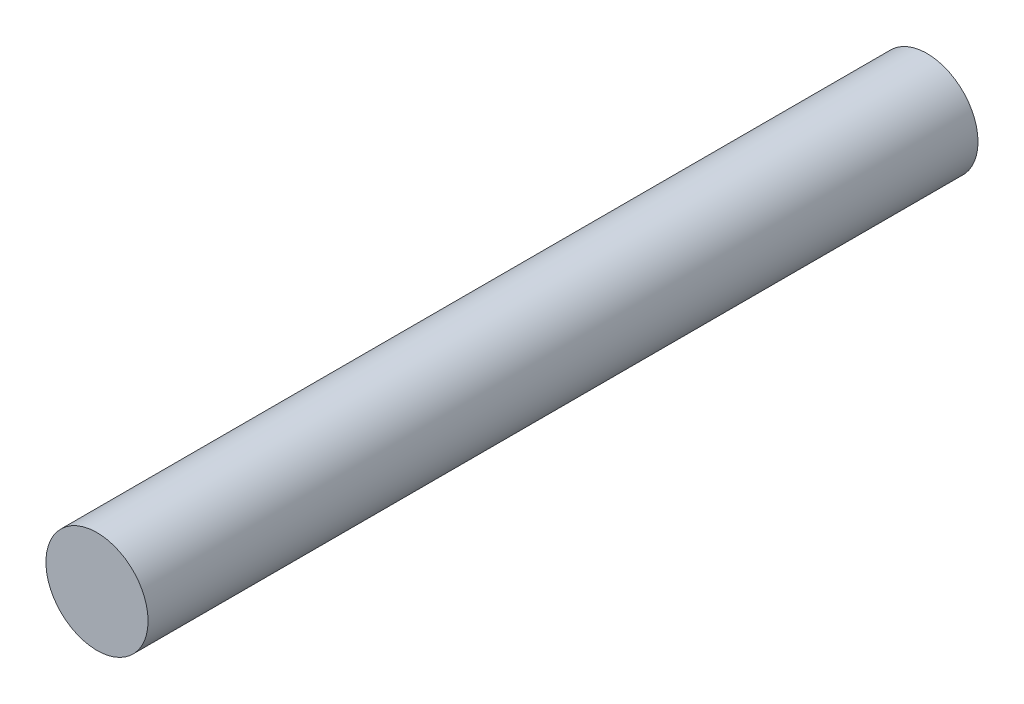
ISO-10303-21;
HEADER;
FILE_DESCRIPTION(('STEP AP214'),'2;1');
FILE_NAME('part.step','',(''),(''),'','','');
FILE_SCHEMA(('AUTOMOTIVE_DESIGN { 1 0 10303 214 1 1 1 1 }'));
ENDSEC;
DATA;
#1=APPLICATION_CONTEXT('core data for automotive mechanical design processes');
#2=APPLICATION_PROTOCOL_DEFINITION('international standard','automotive_design',2000,#1);
#3=PRODUCT_CONTEXT('',#1,'mechanical');
#4=PRODUCT('Part','Part','',(#3));
#5=PRODUCT_RELATED_PRODUCT_CATEGORY('part','',(#4));
#6=PRODUCT_DEFINITION_FORMATION('','',#4);
#7=PRODUCT_DEFINITION_CONTEXT('part definition',#1,'design');
#8=PRODUCT_DEFINITION('design','',#6,#7);
#9=PRODUCT_DEFINITION_SHAPE('','',#8);
#10=(LENGTH_UNIT() NAMED_UNIT(*) SI_UNIT(.MILLI.,.METRE.));
#11=(NAMED_UNIT(*) PLANE_ANGLE_UNIT() SI_UNIT($,.RADIAN.));
#12=(NAMED_UNIT(*) SI_UNIT($,.STERADIAN.) SOLID_ANGLE_UNIT());
#13=UNCERTAINTY_MEASURE_WITH_UNIT(LENGTH_MEASURE(1.E-05),#10,'distance_accuracy_value','');
#14=(GEOMETRIC_REPRESENTATION_CONTEXT(3) GLOBAL_UNCERTAINTY_ASSIGNED_CONTEXT((#13)) GLOBAL_UNIT_ASSIGNED_CONTEXT((#10,
#11,#12)) REPRESENTATION_CONTEXT('',''));
#15=CARTESIAN_POINT('',(0.,0.,0.));
#16=DIRECTION('',(0.,0.,1.));
#17=DIRECTION('',(1.,0.,0.));
#18=AXIS2_PLACEMENT_3D('',#15,#16,#17);
#19=CARTESIAN_POINT('',(0.,0.,65.));
#20=DIRECTION('',(0.,0.,-1.));
#21=DIRECTION('',(-1.,0.,0.));
#22=AXIS2_PLACEMENT_3D('',#19,#20,#21);
#23=CYLINDRICAL_SURFACE('',#22,4.);
#24=CARTESIAN_POINT('',(0.,0.,65.));
#25=DIRECTION('',(0.,0.,1.));
#26=DIRECTION('',(1.,0.,0.));
#27=AXIS2_PLACEMENT_3D('',#24,#25,#26);
#28=CIRCLE('',#27,4.);
#29=CARTESIAN_POINT('',(4.,0.,65.));
#30=VERTEX_POINT('',#29);
#31=EDGE_CURVE('E10',#30,#30,#28,.T.);
#32=ORIENTED_EDGE('',*,*,#31,.F.);
#33=EDGE_LOOP('',(#32));
#34=FACE_BOUND('',#33,.T.);
#35=CARTESIAN_POINT('',(0.,0.,0.));
#36=DIRECTION('',(0.,0.,1.));
#37=DIRECTION('',(1.,0.,0.));
#38=AXIS2_PLACEMENT_3D('',#35,#36,#37);
#39=CIRCLE('',#38,4.);
#40=CARTESIAN_POINT('',(4.,0.,0.));
#41=VERTEX_POINT('',#40);
#42=EDGE_CURVE('E40',#41,#41,#39,.T.);
#43=ORIENTED_EDGE('',*,*,#42,.T.);
#44=EDGE_LOOP('',(#43));
#45=FACE_BOUND('',#44,.T.);
#46=ADVANCED_FACE('F37',(#34,#45),#23,.T.);
#47=CARTESIAN_POINT('',(0.,0.,65.));
#48=DIRECTION('',(0.,0.,1.));
#49=DIRECTION('',(1.,0.,0.));
#50=AXIS2_PLACEMENT_3D('',#47,#48,#49);
#51=PLANE('',#50);
#52=ORIENTED_EDGE('',*,*,#31,.T.);
#53=EDGE_LOOP('',(#52));
#54=FACE_BOUND('',#53,.T.);
#55=ADVANCED_FACE('F54',(#54),#51,.T.);
#56=CARTESIAN_POINT('',(0.,0.,0.));
#57=DIRECTION('',(0.,0.,1.));
#58=DIRECTION('',(1.,0.,0.));
#59=AXIS2_PLACEMENT_3D('',#56,#57,#58);
#60=PLANE('',#59);
#61=ORIENTED_EDGE('',*,*,#42,.F.);
#62=EDGE_LOOP('',(#61));
#63=FACE_BOUND('',#62,.T.);
#64=ADVANCED_FACE('F52',(#63),#60,.F.);
#65=CLOSED_SHELL('',(#46,#55,#64));
#66=MANIFOLD_SOLID_BREP('B2',#65);
#67=ADVANCED_BREP_SHAPE_REPRESENTATION('',(#18,#66),#14);
#68=SHAPE_DEFINITION_REPRESENTATION(#9,#67);
ENDSEC;
END-ISO-10303-21;
